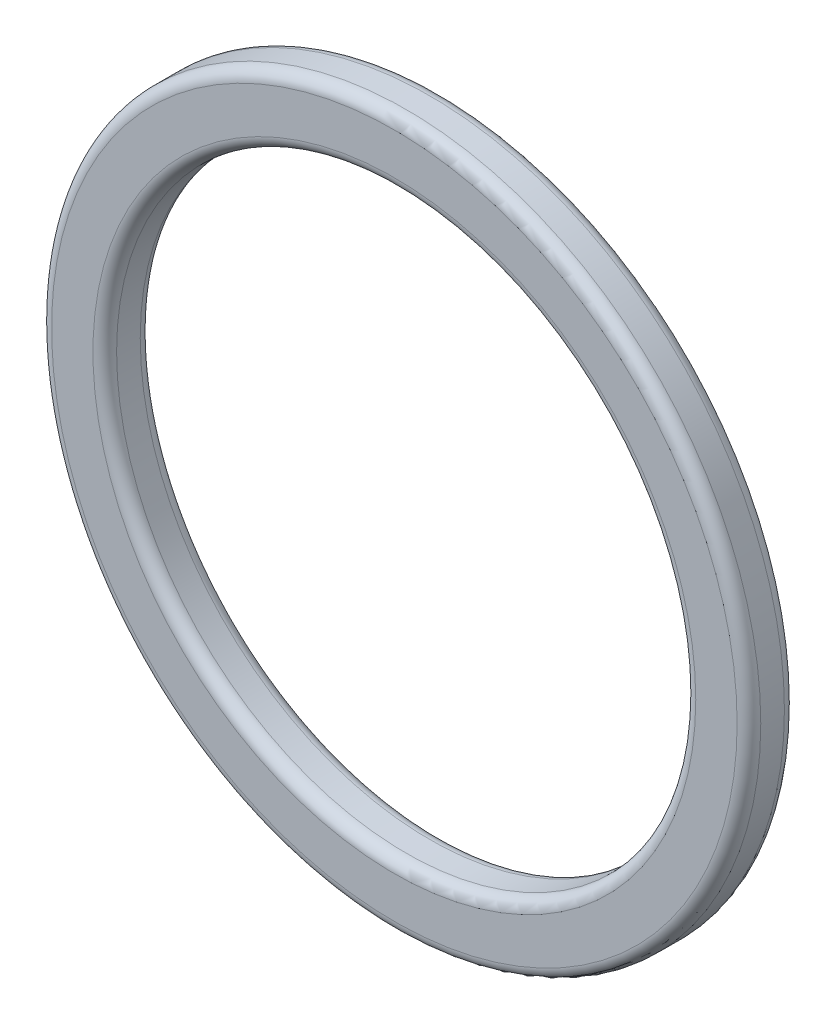
ISO-10303-21;
HEADER;
FILE_DESCRIPTION(('STEP AP214'),'2;1');
FILE_NAME('part.step','',(''),(''),'','','');
FILE_SCHEMA(('AUTOMOTIVE_DESIGN { 1 0 10303 214 1 1 1 1 }'));
ENDSEC;
DATA;
#1=APPLICATION_CONTEXT('core data for automotive mechanical design processes');
#2=APPLICATION_PROTOCOL_DEFINITION('international standard','automotive_design',2000,#1);
#3=PRODUCT_CONTEXT('',#1,'mechanical');
#4=PRODUCT('Part','Part','',(#3));
#5=PRODUCT_RELATED_PRODUCT_CATEGORY('part','',(#4));
#6=PRODUCT_DEFINITION_FORMATION('','',#4);
#7=PRODUCT_DEFINITION_CONTEXT('part definition',#1,'design');
#8=PRODUCT_DEFINITION('design','',#6,#7);
#9=PRODUCT_DEFINITION_SHAPE('','',#8);
#10=(LENGTH_UNIT() NAMED_UNIT(*) SI_UNIT(.MILLI.,.METRE.));
#11=(NAMED_UNIT(*) PLANE_ANGLE_UNIT() SI_UNIT($,.RADIAN.));
#12=(NAMED_UNIT(*) SI_UNIT($,.STERADIAN.) SOLID_ANGLE_UNIT());
#13=UNCERTAINTY_MEASURE_WITH_UNIT(LENGTH_MEASURE(1.E-05),#10,'distance_accuracy_value','');
#14=(GEOMETRIC_REPRESENTATION_CONTEXT(3) GLOBAL_UNCERTAINTY_ASSIGNED_CONTEXT((#13)) GLOBAL_UNIT_ASSIGNED_CONTEXT((#10,
#11,#12)) REPRESENTATION_CONTEXT('',''));
#15=CARTESIAN_POINT('',(0.,0.,0.));
#16=DIRECTION('',(0.,0.,1.));
#17=DIRECTION('',(1.,0.,0.));
#18=AXIS2_PLACEMENT_3D('',#15,#16,#17);
#19=CARTESIAN_POINT('',(0.,0.,2.));
#20=DIRECTION('',(0.,0.,1.));
#21=DIRECTION('',(1.,0.,0.));
#22=AXIS2_PLACEMENT_3D('',#19,#20,#21);
#23=PLANE('',#22);
#24=CARTESIAN_POINT('',(0.,0.,2.));
#25=DIRECTION('',(0.,0.,1.));
#26=DIRECTION('',(1.,0.,0.));
#27=AXIS2_PLACEMENT_3D('',#24,#25,#26);
#28=CIRCLE('',#27,12.75);
#29=CARTESIAN_POINT('',(12.75,0.,2.));
#30=VERTEX_POINT('',#29);
#31=EDGE_CURVE('E64',#30,#30,#28,.F.);
#32=ORIENTED_EDGE('',*,*,#31,.T.);
#33=EDGE_LOOP('',(#32));
#34=FACE_BOUND('',#33,.T.);
#35=CARTESIAN_POINT('',(0.,0.,2.));
#36=DIRECTION('',(0.,0.,1.));
#37=DIRECTION('',(1.,0.,0.));
#38=AXIS2_PLACEMENT_3D('',#35,#36,#37);
#39=CIRCLE('',#38,14.5);
#40=CARTESIAN_POINT('',(14.5,0.,2.));
#41=VERTEX_POINT('',#40);
#42=EDGE_CURVE('E68',#41,#41,#39,.T.);
#43=ORIENTED_EDGE('',*,*,#42,.T.);
#44=EDGE_LOOP('',(#43));
#45=FACE_BOUND('',#44,.T.);
#46=ADVANCED_FACE('F36',(#34,#45),#23,.T.);
#47=CARTESIAN_POINT('',(0.,0.,0.));
#48=DIRECTION('',(0.,0.,1.));
#49=DIRECTION('',(1.,0.,0.));
#50=AXIS2_PLACEMENT_3D('',#47,#48,#49);
#51=PLANE('',#50);
#52=CARTESIAN_POINT('',(0.,0.,0.));
#53=DIRECTION('',(0.,0.,1.));
#54=DIRECTION('',(1.,0.,0.));
#55=AXIS2_PLACEMENT_3D('',#52,#53,#54);
#56=CIRCLE('',#55,12.75);
#57=CARTESIAN_POINT('',(12.75,0.,0.));
#58=VERTEX_POINT('',#57);
#59=EDGE_CURVE('E44',#58,#58,#56,.T.);
#60=ORIENTED_EDGE('',*,*,#59,.T.);
#61=EDGE_LOOP('',(#60));
#62=FACE_BOUND('',#61,.T.);
#63=CARTESIAN_POINT('',(0.,0.,0.));
#64=DIRECTION('',(0.,0.,1.));
#65=DIRECTION('',(1.,0.,0.));
#66=AXIS2_PLACEMENT_3D('',#63,#64,#65);
#67=CIRCLE('',#66,14.5);
#68=CARTESIAN_POINT('',(14.5,0.,0.));
#69=VERTEX_POINT('',#68);
#70=EDGE_CURVE('E49',#69,#69,#67,.F.);
#71=ORIENTED_EDGE('',*,*,#70,.T.);
#72=EDGE_LOOP('',(#71));
#73=FACE_BOUND('',#72,.T.);
#74=ADVANCED_FACE('F96',(#62,#73),#51,.F.);
#75=CARTESIAN_POINT('',(0.,0.,2.));
#76=DIRECTION('',(0.,0.,-1.));
#77=DIRECTION('',(-1.,0.,0.));
#78=AXIS2_PLACEMENT_3D('',#75,#76,#77);
#79=CYLINDRICAL_SURFACE('',#78,15.);
#80=CARTESIAN_POINT('',(0.,0.,0.5));
#81=DIRECTION('',(0.,0.,1.));
#82=DIRECTION('',(1.,0.,0.));
#83=AXIS2_PLACEMENT_3D('',#80,#81,#82);
#84=CIRCLE('',#83,15.);
#85=CARTESIAN_POINT('',(15.,0.,0.5));
#86=VERTEX_POINT('',#85);
#87=EDGE_CURVE('E54',#86,#86,#84,.T.);
#88=ORIENTED_EDGE('',*,*,#87,.T.);
#89=EDGE_LOOP('',(#88));
#90=FACE_BOUND('',#89,.T.);
#91=CARTESIAN_POINT('',(0.,0.,1.5));
#92=DIRECTION('',(0.,0.,1.));
#93=DIRECTION('',(1.,0.,0.));
#94=AXIS2_PLACEMENT_3D('',#91,#92,#93);
#95=CIRCLE('',#94,15.);
#96=CARTESIAN_POINT('',(15.,0.,1.5));
#97=VERTEX_POINT('',#96);
#98=EDGE_CURVE('E60',#97,#97,#95,.F.);
#99=ORIENTED_EDGE('',*,*,#98,.T.);
#100=EDGE_LOOP('',(#99));
#101=FACE_BOUND('',#100,.T.);
#102=ADVANCED_FACE('F91',(#90,#101),#79,.T.);
#103=CARTESIAN_POINT('',(0.,0.,2.));
#104=DIRECTION('',(0.,0.,-1.));
#105=DIRECTION('',(-1.,0.,0.));
#106=AXIS2_PLACEMENT_3D('',#103,#104,#105);
#107=CYLINDRICAL_SURFACE('',#106,12.25);
#108=CARTESIAN_POINT('',(0.,0.,0.5));
#109=DIRECTION('',(0.,0.,1.));
#110=DIRECTION('',(1.,0.,0.));
#111=AXIS2_PLACEMENT_3D('',#108,#109,#110);
#112=CIRCLE('',#111,12.25);
#113=CARTESIAN_POINT('',(12.25,0.,0.5));
#114=VERTEX_POINT('',#113);
#115=EDGE_CURVE('E10',#114,#114,#112,.F.);
#116=ORIENTED_EDGE('',*,*,#115,.T.);
#117=EDGE_LOOP('',(#116));
#118=FACE_BOUND('',#117,.T.);
#119=CARTESIAN_POINT('',(0.,0.,1.5));
#120=DIRECTION('',(0.,0.,1.));
#121=DIRECTION('',(1.,0.,0.));
#122=AXIS2_PLACEMENT_3D('',#119,#120,#121);
#123=CIRCLE('',#122,12.25);
#124=CARTESIAN_POINT('',(12.25,0.,1.5));
#125=VERTEX_POINT('',#124);
#126=EDGE_CURVE('E72',#125,#125,#123,.T.);
#127=ORIENTED_EDGE('',*,*,#126,.T.);
#128=EDGE_LOOP('',(#127));
#129=FACE_BOUND('',#128,.T.);
#130=ADVANCED_FACE('F77',(#118,#129),#107,.F.);
#131=CARTESIAN_POINT('',(0.,0.,1.5));
#132=DIRECTION('',(0.,0.,1.));
#133=DIRECTION('',(1.,0.,0.));
#134=AXIS2_PLACEMENT_3D('',#131,#132,#133);
#135=TOROIDAL_SURFACE('',#134,12.75,0.5);
#136=ORIENTED_EDGE('',*,*,#31,.F.);
#137=EDGE_LOOP('',(#136));
#138=FACE_BOUND('',#137,.T.);
#139=ORIENTED_EDGE('',*,*,#126,.F.);
#140=EDGE_LOOP('',(#139));
#141=FACE_BOUND('',#140,.T.);
#142=ADVANCED_FACE('F79',(#138,#141),#135,.T.);
#143=CARTESIAN_POINT('',(0.,0.,1.5));
#144=DIRECTION('',(0.,0.,1.));
#145=DIRECTION('',(1.,0.,0.));
#146=AXIS2_PLACEMENT_3D('',#143,#144,#145);
#147=TOROIDAL_SURFACE('',#146,14.5,0.5);
#148=ORIENTED_EDGE('',*,*,#98,.F.);
#149=EDGE_LOOP('',(#148));
#150=FACE_BOUND('',#149,.T.);
#151=ORIENTED_EDGE('',*,*,#42,.F.);
#152=EDGE_LOOP('',(#151));
#153=FACE_BOUND('',#152,.T.);
#154=ADVANCED_FACE('F81',(#150,#153),#147,.T.);
#155=CARTESIAN_POINT('',(0.,0.,0.5));
#156=DIRECTION('',(0.,0.,1.));
#157=DIRECTION('',(1.,0.,0.));
#158=AXIS2_PLACEMENT_3D('',#155,#156,#157);
#159=TOROIDAL_SURFACE('',#158,14.5,0.5);
#160=ORIENTED_EDGE('',*,*,#70,.F.);
#161=EDGE_LOOP('',(#160));
#162=FACE_BOUND('',#161,.T.);
#163=ORIENTED_EDGE('',*,*,#87,.F.);
#164=EDGE_LOOP('',(#163));
#165=FACE_BOUND('',#164,.T.);
#166=ADVANCED_FACE('F88',(#162,#165),#159,.T.);
#167=CARTESIAN_POINT('',(0.,0.,0.5));
#168=DIRECTION('',(0.,0.,1.));
#169=DIRECTION('',(1.,0.,0.));
#170=AXIS2_PLACEMENT_3D('',#167,#168,#169);
#171=TOROIDAL_SURFACE('',#170,12.75,0.5);
#172=ORIENTED_EDGE('',*,*,#115,.F.);
#173=EDGE_LOOP('',(#172));
#174=FACE_BOUND('',#173,.T.);
#175=ORIENTED_EDGE('',*,*,#59,.F.);
#176=EDGE_LOOP('',(#175));
#177=FACE_BOUND('',#176,.T.);
#178=ADVANCED_FACE('F38',(#174,#177),#171,.T.);
#179=CLOSED_SHELL('',(#46,#74,#102,#130,#142,#154,#166,#178));
#180=MANIFOLD_SOLID_BREP('B2',#179);
#181=ADVANCED_BREP_SHAPE_REPRESENTATION('',(#18,#180),#14);
#182=SHAPE_DEFINITION_REPRESENTATION(#9,#181);
ENDSEC;
END-ISO-10303-21;
